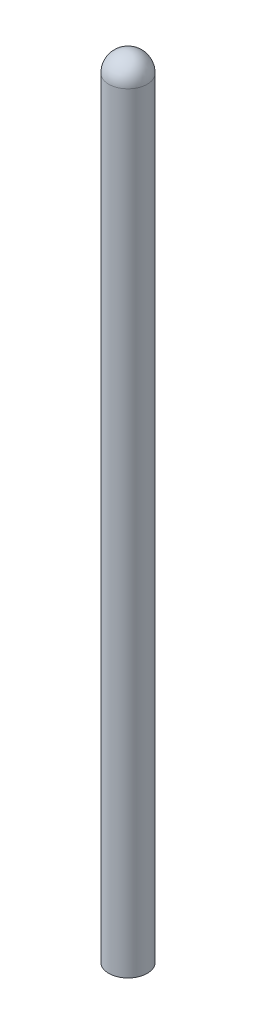
ISO-10303-21;
HEADER;
FILE_DESCRIPTION(('STEP AP214'),'2;1');
FILE_NAME('part.step','',(''),(''),'','','');
FILE_SCHEMA(('AUTOMOTIVE_DESIGN { 1 0 10303 214 1 1 1 1 }'));
ENDSEC;
DATA;
#1=APPLICATION_CONTEXT('core data for automotive mechanical design processes');
#2=APPLICATION_PROTOCOL_DEFINITION('international standard','automotive_design',2000,#1);
#3=PRODUCT_CONTEXT('',#1,'mechanical');
#4=PRODUCT('Part','Part','',(#3));
#5=PRODUCT_RELATED_PRODUCT_CATEGORY('part','',(#4));
#6=PRODUCT_DEFINITION_FORMATION('','',#4);
#7=PRODUCT_DEFINITION_CONTEXT('part definition',#1,'design');
#8=PRODUCT_DEFINITION('design','',#6,#7);
#9=PRODUCT_DEFINITION_SHAPE('','',#8);
#10=(LENGTH_UNIT() NAMED_UNIT(*) SI_UNIT(.MILLI.,.METRE.));
#11=(NAMED_UNIT(*) PLANE_ANGLE_UNIT() SI_UNIT($,.RADIAN.));
#12=(NAMED_UNIT(*) SI_UNIT($,.STERADIAN.) SOLID_ANGLE_UNIT());
#13=UNCERTAINTY_MEASURE_WITH_UNIT(LENGTH_MEASURE(1.E-05),#10,'distance_accuracy_value','');
#14=(GEOMETRIC_REPRESENTATION_CONTEXT(3) GLOBAL_UNCERTAINTY_ASSIGNED_CONTEXT((#13)) GLOBAL_UNIT_ASSIGNED_CONTEXT((#10,
#11,#12)) REPRESENTATION_CONTEXT('',''));
#15=CARTESIAN_POINT('',(0.,0.,0.));
#16=DIRECTION('',(0.,0.,1.));
#17=DIRECTION('',(1.,0.,0.));
#18=AXIS2_PLACEMENT_3D('',#15,#16,#17);
#19=CARTESIAN_POINT('',(0.,30.,0.));
#20=DIRECTION('',(0.,-1.,0.));
#21=DIRECTION('',(0.,0.,-1.));
#22=AXIS2_PLACEMENT_3D('',#19,#20,#21);
#23=CYLINDRICAL_SURFACE('',#22,0.75);
#24=CARTESIAN_POINT('',(0.,30.,0.));
#25=DIRECTION('',(0.,1.,0.));
#26=DIRECTION('',(0.,0.,1.));
#27=AXIS2_PLACEMENT_3D('',#24,#25,#26);
#28=CIRCLE('',#27,0.75);
#29=CARTESIAN_POINT('',(0.,30.,0.75));
#30=VERTEX_POINT('',#29);
#31=EDGE_CURVE('E10',#30,#30,#28,.T.);
#32=ORIENTED_EDGE('',*,*,#31,.F.);
#33=EDGE_LOOP('',(#32));
#34=FACE_BOUND('',#33,.T.);
#35=CARTESIAN_POINT('',(0.,0.,0.));
#36=DIRECTION('',(0.,1.,0.));
#37=DIRECTION('',(0.,0.,1.));
#38=AXIS2_PLACEMENT_3D('',#35,#36,#37);
#39=CIRCLE('',#38,0.75);
#40=CARTESIAN_POINT('',(0.,0.,0.75));
#41=VERTEX_POINT('',#40);
#42=EDGE_CURVE('E35',#41,#41,#39,.T.);
#43=ORIENTED_EDGE('',*,*,#42,.T.);
#44=EDGE_LOOP('',(#43));
#45=FACE_BOUND('',#44,.T.);
#46=ADVANCED_FACE('F32',(#34,#45),#23,.T.);
#47=CARTESIAN_POINT('',(0.,0.,0.));
#48=DIRECTION('',(0.,1.,0.));
#49=DIRECTION('',(0.,0.,1.));
#50=AXIS2_PLACEMENT_3D('',#47,#48,#49);
#51=PLANE('',#50);
#52=ORIENTED_EDGE('',*,*,#42,.F.);
#53=EDGE_LOOP('',(#52));
#54=FACE_BOUND('',#53,.T.);
#55=ADVANCED_FACE('F45',(#54),#51,.F.);
#56=CARTESIAN_POINT('',(0.,30.,0.));
#57=DIRECTION('',(0.,1.,0.));
#58=DIRECTION('',(0.,0.,-1.));
#59=AXIS2_PLACEMENT_3D('',#56,#57,#58);
#60=SPHERICAL_SURFACE('',#59,0.750000000000001);
#61=ORIENTED_EDGE('',*,*,#31,.T.);
#62=EDGE_LOOP('',(#61));
#63=FACE_BOUND('',#62,.T.);
#64=ADVANCED_FACE('F47',(#63),#60,.T.);
#65=CLOSED_SHELL('',(#46,#55,#64));
#66=MANIFOLD_SOLID_BREP('B2',#65);
#67=ADVANCED_BREP_SHAPE_REPRESENTATION('',(#18,#66),#14);
#68=SHAPE_DEFINITION_REPRESENTATION(#9,#67);
ENDSEC;
END-ISO-10303-21;
